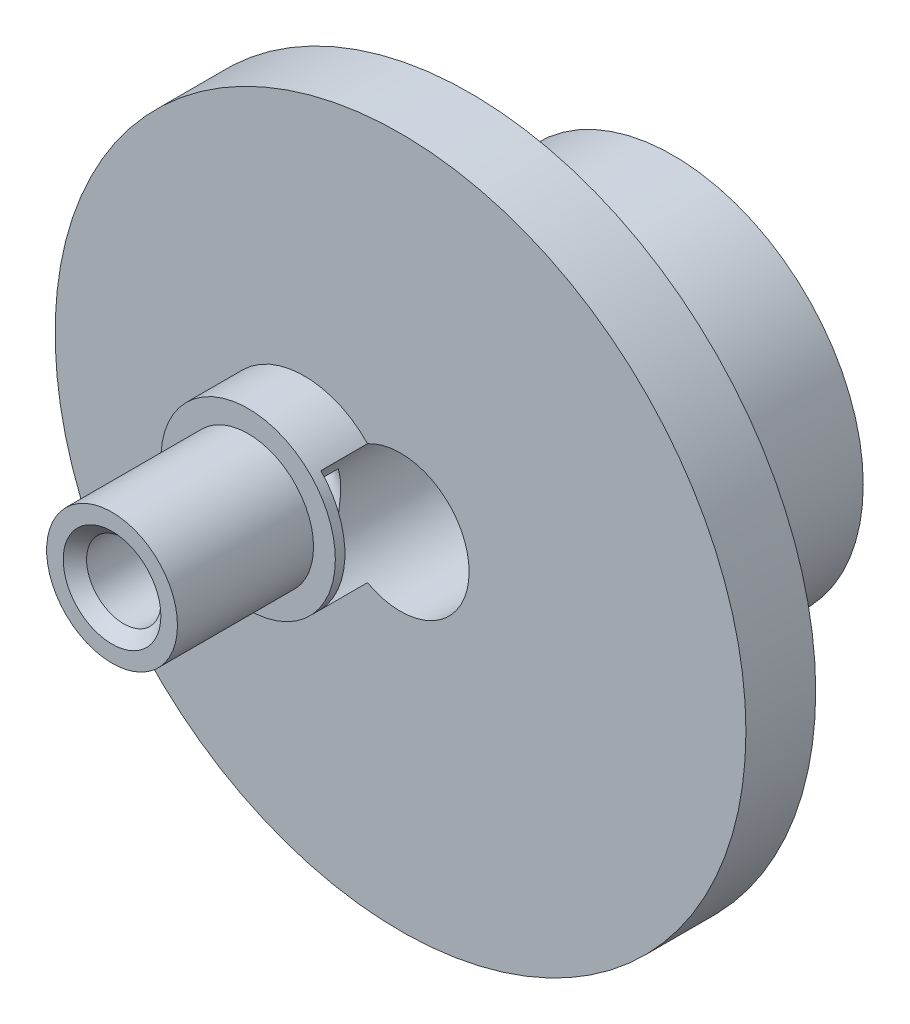
ISO-10303-21;
HEADER;
FILE_DESCRIPTION(('STEP AP214'),'2;1');
FILE_NAME('part.step','',(''),(''),'','','');
FILE_SCHEMA(('AUTOMOTIVE_DESIGN { 1 0 10303 214 1 1 1 1 }'));
ENDSEC;
DATA;
#1=APPLICATION_CONTEXT('core data for automotive mechanical design processes');
#2=APPLICATION_PROTOCOL_DEFINITION('international standard','automotive_design',2000,#1);
#3=PRODUCT_CONTEXT('',#1,'mechanical');
#4=PRODUCT('Part','Part','',(#3));
#5=PRODUCT_RELATED_PRODUCT_CATEGORY('part','',(#4));
#6=PRODUCT_DEFINITION_FORMATION('','',#4);
#7=PRODUCT_DEFINITION_CONTEXT('part definition',#1,'design');
#8=PRODUCT_DEFINITION('design','',#6,#7);
#9=PRODUCT_DEFINITION_SHAPE('','',#8);
#10=(LENGTH_UNIT() NAMED_UNIT(*) SI_UNIT(.MILLI.,.METRE.));
#11=(NAMED_UNIT(*) PLANE_ANGLE_UNIT() SI_UNIT($,.RADIAN.));
#12=(NAMED_UNIT(*) SI_UNIT($,.STERADIAN.) SOLID_ANGLE_UNIT());
#13=UNCERTAINTY_MEASURE_WITH_UNIT(LENGTH_MEASURE(1.E-05),#10,'distance_accuracy_value','');
#14=(GEOMETRIC_REPRESENTATION_CONTEXT(3) GLOBAL_UNCERTAINTY_ASSIGNED_CONTEXT((#13)) GLOBAL_UNIT_ASSIGNED_CONTEXT((#10,
#11,#12)) REPRESENTATION_CONTEXT('',''));
#15=CARTESIAN_POINT('',(0.,0.,0.));
#16=DIRECTION('',(0.,0.,1.));
#17=DIRECTION('',(1.,0.,0.));
#18=AXIS2_PLACEMENT_3D('',#15,#16,#17);
#19=CARTESIAN_POINT('',(0.,0.,10.922));
#20=DIRECTION('',(0.,0.,-1.));
#21=DIRECTION('',(-1.,0.,0.));
#22=AXIS2_PLACEMENT_3D('',#19,#20,#21);
#23=CYLINDRICAL_SURFACE('',#22,6.9215);
#24=CARTESIAN_POINT('',(0.,0.,0.));
#25=DIRECTION('',(0.,0.,1.));
#26=DIRECTION('',(1.,0.,0.));
#27=AXIS2_PLACEMENT_3D('',#24,#25,#26);
#28=CIRCLE('',#27,6.9215);
#29=CARTESIAN_POINT('',(6.9215,0.,0.));
#30=VERTEX_POINT('',#29);
#31=EDGE_CURVE('E172',#30,#30,#28,.T.);
#32=ORIENTED_EDGE('',*,*,#31,.T.);
#33=EDGE_LOOP('',(#32));
#34=FACE_BOUND('',#33,.T.);
#35=CARTESIAN_POINT('',(0.,0.,7.381999968));
#36=DIRECTION('',(0.,0.,1.));
#37=DIRECTION('',(1.,0.,0.));
#38=AXIS2_PLACEMENT_3D('',#35,#36,#37);
#39=CIRCLE('',#38,6.9215);
#40=CARTESIAN_POINT('',(6.9215,0.,7.381999968));
#41=VERTEX_POINT('',#40);
#42=EDGE_CURVE('E14',#41,#41,#39,.T.);
#43=ORIENTED_EDGE('',*,*,#42,.F.);
#44=EDGE_LOOP('',(#43));
#45=FACE_BOUND('',#44,.T.);
#46=ADVANCED_FACE('F94',(#34,#45),#23,.T.);
#47=CARTESIAN_POINT('',(0.,0.,19.3810734136088));
#48=DIRECTION('',(0.,0.,-1.));
#49=DIRECTION('',(-1.,0.,0.));
#50=AXIS2_PLACEMENT_3D('',#47,#48,#49);
#51=CYLINDRICAL_SURFACE('',#50,2.49682);
#52=CARTESIAN_POINT('',(0.,0.,0.));
#53=DIRECTION('',(0.,0.,-1.));
#54=DIRECTION('',(-1.,0.,0.));
#55=AXIS2_PLACEMENT_3D('',#52,#53,#54);
#56=CIRCLE('',#55,2.49682);
#57=CARTESIAN_POINT('',(-2.49682,0.,0.));
#58=VERTEX_POINT('',#57);
#59=EDGE_CURVE('E153',#58,#58,#56,.T.);
#60=ORIENTED_EDGE('',*,*,#59,.T.);
#61=EDGE_LOOP('',(#60));
#62=FACE_BOUND('',#61,.T.);
#63=CARTESIAN_POINT('',(0.,0.,9.921999968));
#64=DIRECTION('',(0.,0.,1.));
#65=DIRECTION('',(1.,0.,0.));
#66=AXIS2_PLACEMENT_3D('',#63,#64,#65);
#67=CIRCLE('',#66,2.49682);
#68=CARTESIAN_POINT('',(-1.2004978732,2.18927270316931,9.921999968));
#69=VERTEX_POINT('',#68);
#70=CARTESIAN_POINT('',(-1.2004978732,-2.18927270316931,9.921999968));
#71=VERTEX_POINT('',#70);
#72=EDGE_CURVE('E102',#69,#71,#67,.F.);
#73=ORIENTED_EDGE('',*,*,#72,.F.);
#74=DIRECTION('',(0.,0.,-1.));
#75=VECTOR('',#74,1.);
#76=CARTESIAN_POINT('',(-1.2004978732,2.18927270316931,5.81025));
#77=LINE('',#76,#75);
#78=CARTESIAN_POINT('',(-1.2004978732,2.18927270316931,11.6205));
#79=VERTEX_POINT('',#78);
#80=EDGE_CURVE('E138',#79,#69,#77,.T.);
#81=ORIENTED_EDGE('',*,*,#80,.F.);
#82=CARTESIAN_POINT('',(0.,0.,11.6205));
#83=DIRECTION('',(0.,0.,1.));
#84=DIRECTION('',(1.,0.,0.));
#85=AXIS2_PLACEMENT_3D('',#82,#83,#84);
#86=CIRCLE('',#85,2.49682);
#87=CARTESIAN_POINT('',(-2.3792455157,0.757166354522854,11.6205));
#88=VERTEX_POINT('',#87);
#89=EDGE_CURVE('E266',#88,#79,#86,.F.);
#90=ORIENTED_EDGE('',*,*,#89,.F.);
#91=DIRECTION('',(0.,0.,-1.));
#92=VECTOR('',#91,1.);
#93=CARTESIAN_POINT('',(-2.3792455157,0.757166354522854,5.81025));
#94=LINE('',#93,#92);
#95=CARTESIAN_POINT('',(-2.3792455157,0.757166354522847,9.81075000000001));
#96=VERTEX_POINT('',#95);
#97=EDGE_CURVE('E158',#96,#88,#94,.F.);
#98=ORIENTED_EDGE('',*,*,#97,.F.);
#99=CARTESIAN_POINT('',(-2.37911687008878,-0.757570479136415,9.81095000000001));
#100=CARTESIAN_POINT('',(-2.39147146822047,-0.718757635546721,9.79176594709956));
#101=CARTESIAN_POINT('',(-2.4029792768214,-0.679345784455449,9.77317697603531));
#102=CARTESIAN_POINT('',(-2.42423202523277,-0.599118752103615,9.73770947792294));
#103=CARTESIAN_POINT('',(-2.43397035667407,-0.558298961323352,9.72083746222504));
#104=CARTESIAN_POINT('',(-2.45163500529156,-0.474803624262905,9.68927271732209));
#105=CARTESIAN_POINT('',(-2.45953656026174,-0.43211102289559,9.67461061296046));
#106=CARTESIAN_POINT('',(-2.47319762621052,-0.345432484969661,9.64859580715303));
#107=CARTESIAN_POINT('',(-2.47896020726843,-0.301448500624663,9.63723836760946));
#108=CARTESIAN_POINT('',(-2.48683272137177,-0.225344704134029,9.62144727736346));
#109=CARTESIAN_POINT('',(-2.48951772549734,-0.193503136782259,9.61596042628065));
#110=CARTESIAN_POINT('',(-2.49367068366324,-0.129411292297228,9.6074088085118));
#111=CARTESIAN_POINT('',(-2.49513868766762,-0.0971610319980887,9.6043439423912));
#112=CARTESIAN_POINT('',(-2.49681201637075,-0.0327184654792258,9.60084686885466));
#113=CARTESIAN_POINT('',(-2.49702648571093,-0.000527456578872844,9.60039559528084));
#114=CARTESIAN_POINT('',(-2.49621309896941,0.0637643101307174,9.60209817270417));
#115=CARTESIAN_POINT('',(-2.49518522385072,0.0958650665494218,9.60425206362138));
#116=CARTESIAN_POINT('',(-2.49028504754672,0.19139470371809,9.61441596245164));
#117=CARTESIAN_POINT('',(-2.48460375129006,0.254359182348045,9.62611335050486));
#118=CARTESIAN_POINT('',(-2.46882086103055,0.378116515110095,9.65708852953387));
#119=CARTESIAN_POINT('',(-2.45869061665656,0.438892484323958,9.67641536974739));
#120=CARTESIAN_POINT('',(-2.4374364871541,0.54324691914059,9.71477259129966));
#121=CARTESIAN_POINT('',(-2.42715499705827,0.587409854380692,9.7327295383899));
#122=CARTESIAN_POINT('',(-2.40459626440692,0.673788223531817,9.77056342432556));
#123=CARTESIAN_POINT('',(-2.39234184461781,0.716019570338718,9.79041746053032));
#124=CARTESIAN_POINT('',(-2.37911687008834,0.757570479137775,9.81095000000068));
#125=B_SPLINE_CURVE_WITH_KNOTS('',3,(#99,#100,#101,#102,#103,#104,#105,#106,#107,#108,#109,#110,
#111,#112,#113,#114,#115,#116,#117,#118,#119,#120,#121,#122,#123,#124),.UNSPECIFIED.,.F.,.F.,(4,
2,2,2,2,2,2,2,2,2,2,2,4),(0.,0.135100454060951,0.270695530502885,0.408024440835082,
0.545155473080687,0.642320445617139,0.739481428839369,0.835932721040339,0.932385491224844,
1.12437822829524,1.31762591851567,1.46382436542802,1.60843929451264),.UNSPECIFIED.);
#126=CARTESIAN_POINT('',(-2.37924551570001,-0.757166354522851,9.81075000000001));
#127=VERTEX_POINT('',#126);
#128=EDGE_CURVE('E116',#127,#96,#125,.T.);
#129=ORIENTED_EDGE('',*,*,#128,.F.);
#130=DIRECTION('',(0.,0.,-1.));
#131=VECTOR('',#130,1.);
#132=CARTESIAN_POINT('',(-2.3792455157,-0.757166354522854,5.81025));
#133=LINE('',#132,#131);
#134=CARTESIAN_POINT('',(-2.3792455157,-0.757166354522854,11.6205));
#135=VERTEX_POINT('',#134);
#136=EDGE_CURVE('E170',#135,#127,#133,.T.);
#137=ORIENTED_EDGE('',*,*,#136,.F.);
#138=CARTESIAN_POINT('',(-1.2004978732,-2.18927270316931,11.6205));
#139=VERTEX_POINT('',#138);
#140=EDGE_CURVE('E212',#139,#135,#86,.F.);
#141=ORIENTED_EDGE('',*,*,#140,.F.);
#142=DIRECTION('',(0.,0.,-1.));
#143=VECTOR('',#142,1.);
#144=CARTESIAN_POINT('',(-1.2004978732,-2.18927270316931,5.81025));
#145=LINE('',#144,#143);
#146=EDGE_CURVE('E109',#71,#139,#145,.F.);
#147=ORIENTED_EDGE('',*,*,#146,.F.);
#148=EDGE_LOOP('',(#73,#81,#90,#98,#129,#137,#141,#147));
#149=FACE_BOUND('',#148,.T.);
#150=ADVANCED_FACE('F156',(#62,#149),#51,.F.);
#151=CARTESIAN_POINT('',(0.,0.,0.));
#152=DIRECTION('',(0.,0.,1.));
#153=DIRECTION('',(1.,0.,0.));
#154=AXIS2_PLACEMENT_3D('',#151,#152,#153);
#155=PLANE('',#154);
#156=ORIENTED_EDGE('',*,*,#59,.F.);
#157=EDGE_LOOP('',(#156));
#158=FACE_BOUND('',#157,.T.);
#159=ORIENTED_EDGE('',*,*,#31,.F.);
#160=EDGE_LOOP('',(#159));
#161=FACE_BOUND('',#160,.T.);
#162=ADVANCED_FACE('F222',(#158,#161),#155,.F.);
#163=CARTESIAN_POINT('',(-3.5,0.,25.9030061210692));
#164=DIRECTION('',(0.,0.,-1.));
#165=DIRECTION('',(-1.,0.,0.));
#166=AXIS2_PLACEMENT_3D('',#163,#164,#165);
#167=CYLINDRICAL_SURFACE('',#166,3.175);
#168=ORIENTED_EDGE('',*,*,#80,.T.);
#169=CARTESIAN_POINT('',(-3.5,0.,9.921999968));
#170=DIRECTION('',(0.,0.,1.));
#171=DIRECTION('',(1.,0.,0.));
#172=AXIS2_PLACEMENT_3D('',#169,#170,#171);
#173=CIRCLE('',#172,3.175);
#174=EDGE_CURVE('E142',#69,#71,#173,.T.);
#175=ORIENTED_EDGE('',*,*,#174,.T.);
#176=ORIENTED_EDGE('',*,*,#146,.T.);
#177=CARTESIAN_POINT('',(-3.5,0.,11.6205));
#178=DIRECTION('',(0.,0.,1.));
#179=DIRECTION('',(1.,0.,0.));
#180=AXIS2_PLACEMENT_3D('',#177,#178,#179);
#181=CIRCLE('',#180,3.175);
#182=EDGE_CURVE('E144',#139,#79,#181,.T.);
#183=ORIENTED_EDGE('',*,*,#182,.T.);
#184=EDGE_LOOP('',(#168,#175,#176,#183));
#185=FACE_BOUND('',#184,.T.);
#186=CARTESIAN_POINT('',(-3.5,0.,11.96975));
#187=DIRECTION('',(0.,0.,1.));
#188=DIRECTION('',(1.,0.,0.));
#189=AXIS2_PLACEMENT_3D('',#186,#187,#188);
#190=CIRCLE('',#189,3.175);
#191=CARTESIAN_POINT('',(-0.325,0.,11.96975));
#192=VERTEX_POINT('',#191);
#193=EDGE_CURVE('E178',#192,#192,#190,.T.);
#194=ORIENTED_EDGE('',*,*,#193,.F.);
#195=EDGE_LOOP('',(#194));
#196=FACE_BOUND('',#195,.T.);
#197=ADVANCED_FACE('F140',(#185,#196),#167,.T.);
#198=CARTESIAN_POINT('',(-3.5,0.,11.96975));
#199=DIRECTION('',(0.,0.,1.));
#200=DIRECTION('',(1.,0.,0.));
#201=AXIS2_PLACEMENT_3D('',#198,#199,#200);
#202=PLANE('',#201);
#203=CARTESIAN_POINT('',(-3.5,0.,11.96975));
#204=DIRECTION('',(0.,0.,1.));
#205=DIRECTION('',(1.,0.,0.));
#206=AXIS2_PLACEMENT_3D('',#203,#204,#205);
#207=CIRCLE('',#206,2.38125);
#208=CARTESIAN_POINT('',(-1.11875,0.,11.96975));
#209=VERTEX_POINT('',#208);
#210=EDGE_CURVE('E173',#209,#209,#207,.T.);
#211=ORIENTED_EDGE('',*,*,#210,.F.);
#212=EDGE_LOOP('',(#211));
#213=FACE_BOUND('',#212,.T.);
#214=ORIENTED_EDGE('',*,*,#193,.T.);
#215=EDGE_LOOP('',(#214));
#216=FACE_BOUND('',#215,.T.);
#217=ADVANCED_FACE('F318',(#213,#216),#202,.T.);
#218=CARTESIAN_POINT('',(-3.5,0.,16.92275));
#219=DIRECTION('',(0.,0.,1.));
#220=DIRECTION('',(1.,0.,0.));
#221=AXIS2_PLACEMENT_3D('',#218,#219,#220);
#222=PLANE('',#221);
#223=CARTESIAN_POINT('',(-3.5,0.,16.92275));
#224=DIRECTION('',(0.,0.,1.));
#225=DIRECTION('',(1.,0.,0.));
#226=AXIS2_PLACEMENT_3D('',#223,#224,#225);
#227=CIRCLE('',#226,1.778);
#228=CARTESIAN_POINT('',(-1.722,0.,16.92275));
#229=VERTEX_POINT('',#228);
#230=EDGE_CURVE('E196',#229,#229,#227,.T.);
#231=ORIENTED_EDGE('',*,*,#230,.F.);
#232=EDGE_LOOP('',(#231));
#233=FACE_BOUND('',#232,.T.);
#234=CARTESIAN_POINT('',(-3.5,0.,16.92275));
#235=DIRECTION('',(0.,0.,1.));
#236=DIRECTION('',(1.,0.,0.));
#237=AXIS2_PLACEMENT_3D('',#234,#235,#236);
#238=CIRCLE('',#237,2.38125);
#239=CARTESIAN_POINT('',(-1.11875,0.,16.92275));
#240=VERTEX_POINT('',#239);
#241=EDGE_CURVE('E177',#240,#240,#238,.T.);
#242=ORIENTED_EDGE('',*,*,#241,.T.);
#243=EDGE_LOOP('',(#242));
#244=FACE_BOUND('',#243,.T.);
#245=ADVANCED_FACE('F322',(#233,#244),#222,.T.);
#246=CARTESIAN_POINT('',(-3.5,0.,16.92275));
#247=DIRECTION('',(0.,0.,-1.));
#248=DIRECTION('',(-1.,0.,0.));
#249=AXIS2_PLACEMENT_3D('',#246,#247,#248);
#250=CYLINDRICAL_SURFACE('',#249,2.38125);
#251=ORIENTED_EDGE('',*,*,#210,.T.);
#252=EDGE_LOOP('',(#251));
#253=FACE_BOUND('',#252,.T.);
#254=ORIENTED_EDGE('',*,*,#241,.F.);
#255=EDGE_LOOP('',(#254));
#256=FACE_BOUND('',#255,.T.);
#257=ADVANCED_FACE('F238',(#253,#256),#250,.T.);
#258=CARTESIAN_POINT('',(-3.5,0.,9.81075000000001));
#259=DIRECTION('',(0.,0.,1.));
#260=DIRECTION('',(1.,0.,0.));
#261=AXIS2_PLACEMENT_3D('',#258,#259,#260);
#262=CONICAL_SURFACE('',#261,1.35254999999999,1.02974425867665);
#263=CARTESIAN_POINT('',(-3.5,0.,8.99805596973427));
#264=VERTEX_POINT('',#263);
#265=VERTEX_LOOP('',#264);
#266=FACE_BOUND('',#265,.T.);
#267=CARTESIAN_POINT('',(-3.5,0.,9.81075000000001));
#268=DIRECTION('',(0.,0.,1.));
#269=DIRECTION('',(1.,0.,0.));
#270=AXIS2_PLACEMENT_3D('',#267,#268,#269);
#271=CIRCLE('',#270,1.35254999999999);
#272=EDGE_CURVE('E188',#96,#127,#271,.T.);
#273=ORIENTED_EDGE('',*,*,#272,.T.);
#274=ORIENTED_EDGE('',*,*,#128,.T.);
#275=EDGE_LOOP('',(#273,#274));
#276=FACE_BOUND('',#275,.T.);
#277=ADVANCED_FACE('F214',(#266,#276),#262,.F.);
#278=CARTESIAN_POINT('',(-3.5,0.,16.92275));
#279=DIRECTION('',(0.,0.,1.));
#280=DIRECTION('',(1.,0.,0.));
#281=AXIS2_PLACEMENT_3D('',#278,#279,#280);
#282=CYLINDRICAL_SURFACE('',#281,1.35254999999999);
#283=ORIENTED_EDGE('',*,*,#272,.F.);
#284=ORIENTED_EDGE('',*,*,#97,.T.);
#285=CARTESIAN_POINT('',(-3.5,0.,11.6205));
#286=DIRECTION('',(0.,0.,1.));
#287=DIRECTION('',(1.,0.,0.));
#288=AXIS2_PLACEMENT_3D('',#285,#286,#287);
#289=CIRCLE('',#288,1.35254999999999);
#290=EDGE_CURVE('E164',#88,#135,#289,.F.);
#291=ORIENTED_EDGE('',*,*,#290,.T.);
#292=ORIENTED_EDGE('',*,*,#136,.T.);
#293=EDGE_LOOP('',(#283,#284,#291,#292));
#294=FACE_BOUND('',#293,.T.);
#295=CARTESIAN_POINT('',(-3.5,0.,16.4973));
#296=DIRECTION('',(0.,0.,1.));
#297=DIRECTION('',(1.,0.,0.));
#298=AXIS2_PLACEMENT_3D('',#295,#296,#297);
#299=CIRCLE('',#298,1.35255);
#300=CARTESIAN_POINT('',(-2.14745,0.,16.4973));
#301=VERTEX_POINT('',#300);
#302=EDGE_CURVE('E192',#301,#301,#299,.T.);
#303=ORIENTED_EDGE('',*,*,#302,.T.);
#304=EDGE_LOOP('',(#303));
#305=FACE_BOUND('',#304,.T.);
#306=ADVANCED_FACE('F231',(#294,#305),#282,.F.);
#307=CARTESIAN_POINT('',(-3.5,0.,16.92275));
#308=DIRECTION('',(0.,0.,1.));
#309=DIRECTION('',(1.,0.,0.));
#310=AXIS2_PLACEMENT_3D('',#307,#308,#309);
#311=CONICAL_SURFACE('',#310,1.778,0.785398163397449);
#312=ORIENTED_EDGE('',*,*,#302,.F.);
#313=EDGE_LOOP('',(#312));
#314=FACE_BOUND('',#313,.T.);
#315=ORIENTED_EDGE('',*,*,#230,.T.);
#316=EDGE_LOOP('',(#315));
#317=FACE_BOUND('',#316,.T.);
#318=ADVANCED_FACE('F228',(#314,#317),#311,.F.);
#319=CARTESIAN_POINT('',(0.,0.,11.6205));
#320=DIRECTION('',(0.,0.,1.));
#321=DIRECTION('',(1.,0.,0.));
#322=AXIS2_PLACEMENT_3D('',#319,#320,#321);
#323=PLANE('',#322);
#324=ORIENTED_EDGE('',*,*,#140,.T.);
#325=ORIENTED_EDGE('',*,*,#290,.F.);
#326=ORIENTED_EDGE('',*,*,#89,.T.);
#327=ORIENTED_EDGE('',*,*,#182,.F.);
#328=EDGE_LOOP('',(#324,#325,#326,#327));
#329=FACE_BOUND('',#328,.T.);
#330=ADVANCED_FACE('F225',(#329),#323,.F.);
#331=CARTESIAN_POINT('',(0.,0.,9.921999968));
#332=DIRECTION('',(0.,0.,1.));
#333=DIRECTION('',(1.,0.,0.));
#334=AXIS2_PLACEMENT_3D('',#331,#332,#333);
#335=PLANE('',#334);
#336=ORIENTED_EDGE('',*,*,#72,.T.);
#337=ORIENTED_EDGE('',*,*,#174,.F.);
#338=EDGE_LOOP('',(#336,#337));
#339=FACE_BOUND('',#338,.T.);
#340=CARTESIAN_POINT('',(0.,0.,9.921999968));
#341=DIRECTION('',(0.,0.,1.));
#342=DIRECTION('',(1.,0.,0.));
#343=AXIS2_PLACEMENT_3D('',#340,#341,#342);
#344=CIRCLE('',#343,12.573);
#345=CARTESIAN_POINT('',(12.573,0.,9.921999968));
#346=VERTEX_POINT('',#345);
#347=EDGE_CURVE('E258',#346,#346,#344,.T.);
#348=ORIENTED_EDGE('',*,*,#347,.T.);
#349=EDGE_LOOP('',(#348));
#350=FACE_BOUND('',#349,.T.);
#351=ADVANCED_FACE('F150',(#339,#350),#335,.T.);
#352=CARTESIAN_POINT('',(0.,0.,7.381999968));
#353=DIRECTION('',(0.,0.,1.));
#354=DIRECTION('',(1.,0.,0.));
#355=AXIS2_PLACEMENT_3D('',#352,#353,#354);
#356=CYLINDRICAL_SURFACE('',#355,12.573);
#357=CARTESIAN_POINT('',(0.,0.,7.381999968));
#358=DIRECTION('',(0.,0.,1.));
#359=DIRECTION('',(1.,0.,0.));
#360=AXIS2_PLACEMENT_3D('',#357,#358,#359);
#361=CIRCLE('',#360,12.573);
#362=CARTESIAN_POINT('',(12.573,0.,7.381999968));
#363=VERTEX_POINT('',#362);
#364=EDGE_CURVE('E154',#363,#363,#361,.T.);
#365=ORIENTED_EDGE('',*,*,#364,.T.);
#366=EDGE_LOOP('',(#365));
#367=FACE_BOUND('',#366,.T.);
#368=ORIENTED_EDGE('',*,*,#347,.F.);
#369=EDGE_LOOP('',(#368));
#370=FACE_BOUND('',#369,.T.);
#371=ADVANCED_FACE('F252',(#367,#370),#356,.T.);
#372=CARTESIAN_POINT('',(0.,0.,7.381999968));
#373=DIRECTION('',(0.,0.,1.));
#374=DIRECTION('',(1.,0.,0.));
#375=AXIS2_PLACEMENT_3D('',#372,#373,#374);
#376=PLANE('',#375);
#377=ORIENTED_EDGE('',*,*,#42,.T.);
#378=EDGE_LOOP('',(#377));
#379=FACE_BOUND('',#378,.T.);
#380=ORIENTED_EDGE('',*,*,#364,.F.);
#381=EDGE_LOOP('',(#380));
#382=FACE_BOUND('',#381,.T.);
#383=ADVANCED_FACE('F249',(#379,#382),#376,.F.);
#384=CLOSED_SHELL('',(#46,#150,#162,#197,#217,#245,#257,#277,#306,#318,#330,#351,#371,#383));
#385=MANIFOLD_SOLID_BREP('B2',#384);
#386=ADVANCED_BREP_SHAPE_REPRESENTATION('',(#18,#385),#14);
#387=SHAPE_DEFINITION_REPRESENTATION(#9,#386);
ENDSEC;
END-ISO-10303-21;
